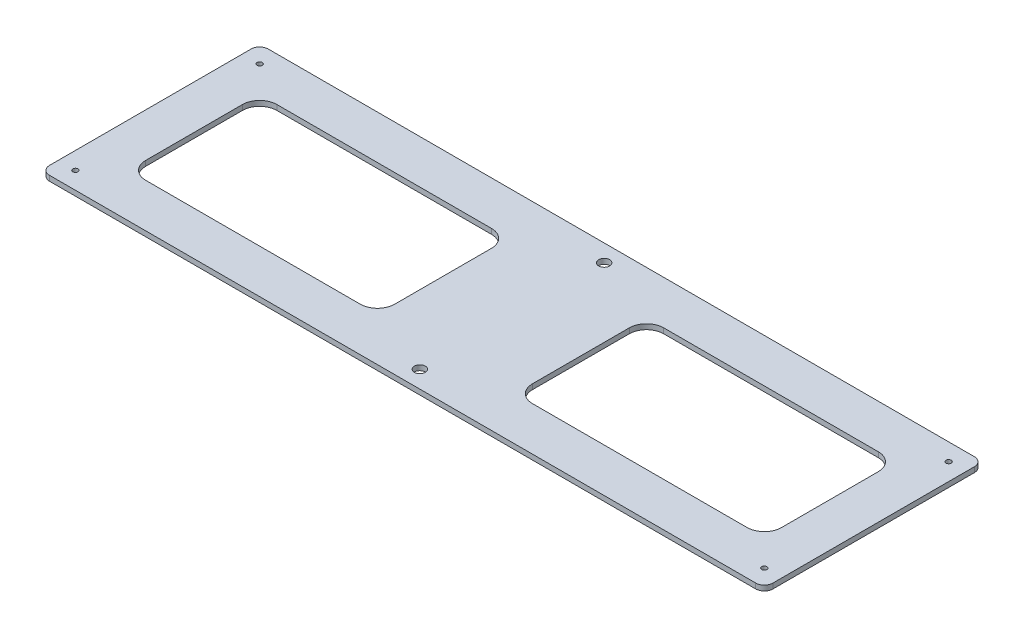
ISO-10303-21;
HEADER;
FILE_DESCRIPTION(('STEP AP214'),'2;1');
FILE_NAME('part.step','',(''),(''),'','','');
FILE_SCHEMA(('AUTOMOTIVE_DESIGN { 1 0 10303 214 1 1 1 1 }'));
ENDSEC;
DATA;
#1=APPLICATION_CONTEXT('core data for automotive mechanical design processes');
#2=APPLICATION_PROTOCOL_DEFINITION('international standard','automotive_design',2000,#1);
#3=PRODUCT_CONTEXT('',#1,'mechanical');
#4=PRODUCT('Part','Part','',(#3));
#5=PRODUCT_RELATED_PRODUCT_CATEGORY('part','',(#4));
#6=PRODUCT_DEFINITION_FORMATION('','',#4);
#7=PRODUCT_DEFINITION_CONTEXT('part definition',#1,'design');
#8=PRODUCT_DEFINITION('design','',#6,#7);
#9=PRODUCT_DEFINITION_SHAPE('','',#8);
#10=(LENGTH_UNIT() NAMED_UNIT(*) SI_UNIT(.MILLI.,.METRE.));
#11=(NAMED_UNIT(*) PLANE_ANGLE_UNIT() SI_UNIT($,.RADIAN.));
#12=(NAMED_UNIT(*) SI_UNIT($,.STERADIAN.) SOLID_ANGLE_UNIT());
#13=UNCERTAINTY_MEASURE_WITH_UNIT(LENGTH_MEASURE(1.E-05),#10,'distance_accuracy_value','');
#14=(GEOMETRIC_REPRESENTATION_CONTEXT(3) GLOBAL_UNCERTAINTY_ASSIGNED_CONTEXT((#13)) GLOBAL_UNIT_ASSIGNED_CONTEXT((#10,
#11,#12)) REPRESENTATION_CONTEXT('',''));
#15=CARTESIAN_POINT('',(0.,0.,0.));
#16=DIRECTION('',(0.,0.,1.));
#17=DIRECTION('',(1.,0.,0.));
#18=AXIS2_PLACEMENT_3D('',#15,#16,#17);
#19=CARTESIAN_POINT('',(210.,3.,-63.5));
#20=DIRECTION('',(-1.,0.,0.));
#21=DIRECTION('',(0.,0.,1.));
#22=AXIS2_PLACEMENT_3D('',#19,#20,#21);
#23=PLANE('',#22);
#24=DIRECTION('',(0.,0.,-1.));
#25=VECTOR('',#24,1.);
#26=CARTESIAN_POINT('',(210.,0.,-63.5));
#27=LINE('',#26,#25);
#28=CARTESIAN_POINT('',(210.,0.,58.5));
#29=VERTEX_POINT('',#28);
#30=CARTESIAN_POINT('',(210.,0.,-58.5));
#31=VERTEX_POINT('',#30);
#32=EDGE_CURVE('E228',#29,#31,#27,.T.);
#33=ORIENTED_EDGE('',*,*,#32,.T.);
#34=DIRECTION('',(0.,-1.,0.));
#35=VECTOR('',#34,1.);
#36=CARTESIAN_POINT('',(210.,3.,-58.5));
#37=LINE('',#36,#35);
#38=CARTESIAN_POINT('',(210.,3.,-58.5));
#39=VERTEX_POINT('',#38);
#40=EDGE_CURVE('E252',#31,#39,#37,.F.);
#41=ORIENTED_EDGE('',*,*,#40,.T.);
#42=DIRECTION('',(0.,0.,-1.));
#43=VECTOR('',#42,1.);
#44=CARTESIAN_POINT('',(210.,3.,-63.5));
#45=LINE('',#44,#43);
#46=CARTESIAN_POINT('',(210.,3.,58.5));
#47=VERTEX_POINT('',#46);
#48=EDGE_CURVE('E226',#47,#39,#45,.T.);
#49=ORIENTED_EDGE('',*,*,#48,.F.);
#50=DIRECTION('',(0.,-1.,0.));
#51=VECTOR('',#50,1.);
#52=CARTESIAN_POINT('',(210.,3.,58.5));
#53=LINE('',#52,#51);
#54=EDGE_CURVE('E249',#47,#29,#53,.T.);
#55=ORIENTED_EDGE('',*,*,#54,.T.);
#56=EDGE_LOOP('',(#33,#41,#49,#55));
#57=FACE_BOUND('',#56,.T.);
#58=ADVANCED_FACE('F33',(#57),#23,.F.);
#59=CARTESIAN_POINT('',(-210.,3.,-63.5));
#60=DIRECTION('',(0.,0.,1.));
#61=DIRECTION('',(1.,0.,0.));
#62=AXIS2_PLACEMENT_3D('',#59,#60,#61);
#63=PLANE('',#62);
#64=DIRECTION('',(-1.,0.,0.));
#65=VECTOR('',#64,1.);
#66=CARTESIAN_POINT('',(-210.,0.,-63.5));
#67=LINE('',#66,#65);
#68=CARTESIAN_POINT('',(205.,0.,-63.5));
#69=VERTEX_POINT('',#68);
#70=CARTESIAN_POINT('',(-205.,0.,-63.5));
#71=VERTEX_POINT('',#70);
#72=EDGE_CURVE('E223',#69,#71,#67,.T.);
#73=ORIENTED_EDGE('',*,*,#72,.T.);
#74=DIRECTION('',(0.,-1.,0.));
#75=VECTOR('',#74,1.);
#76=CARTESIAN_POINT('',(-205.,3.,-63.5));
#77=LINE('',#76,#75);
#78=CARTESIAN_POINT('',(-205.,3.,-63.5));
#79=VERTEX_POINT('',#78);
#80=EDGE_CURVE('E201',#71,#79,#77,.F.);
#81=ORIENTED_EDGE('',*,*,#80,.T.);
#82=DIRECTION('',(-1.,0.,0.));
#83=VECTOR('',#82,1.);
#84=CARTESIAN_POINT('',(-210.,3.,-63.5));
#85=LINE('',#84,#83);
#86=CARTESIAN_POINT('',(205.,3.,-63.5));
#87=VERTEX_POINT('',#86);
#88=EDGE_CURVE('E410',#87,#79,#85,.T.);
#89=ORIENTED_EDGE('',*,*,#88,.F.);
#90=DIRECTION('',(0.,-1.,0.));
#91=VECTOR('',#90,1.);
#92=CARTESIAN_POINT('',(205.,3.,-63.5));
#93=LINE('',#92,#91);
#94=EDGE_CURVE('E206',#87,#69,#93,.T.);
#95=ORIENTED_EDGE('',*,*,#94,.T.);
#96=EDGE_LOOP('',(#73,#81,#89,#95));
#97=FACE_BOUND('',#96,.T.);
#98=ADVANCED_FACE('F429',(#97),#63,.F.);
#99=CARTESIAN_POINT('',(-210.,3.,-63.5));
#100=DIRECTION('',(1.,0.,0.));
#101=DIRECTION('',(0.,0.,-1.));
#102=AXIS2_PLACEMENT_3D('',#99,#100,#101);
#103=PLANE('',#102);
#104=DIRECTION('',(0.,0.,1.));
#105=VECTOR('',#104,1.);
#106=CARTESIAN_POINT('',(-210.,3.,-63.5));
#107=LINE('',#106,#105);
#108=CARTESIAN_POINT('',(-210.,3.,-58.5));
#109=VERTEX_POINT('',#108);
#110=CARTESIAN_POINT('',(-210.,3.,58.5));
#111=VERTEX_POINT('',#110);
#112=EDGE_CURVE('E216',#109,#111,#107,.T.);
#113=ORIENTED_EDGE('',*,*,#112,.F.);
#114=DIRECTION('',(0.,-1.,0.));
#115=VECTOR('',#114,1.);
#116=CARTESIAN_POINT('',(-210.,3.,-58.5));
#117=LINE('',#116,#115);
#118=CARTESIAN_POINT('',(-210.,0.,-58.5));
#119=VERTEX_POINT('',#118);
#120=EDGE_CURVE('E200',#109,#119,#117,.T.);
#121=ORIENTED_EDGE('',*,*,#120,.T.);
#122=DIRECTION('',(0.,0.,1.));
#123=VECTOR('',#122,1.);
#124=CARTESIAN_POINT('',(-210.,0.,-63.5));
#125=LINE('',#124,#123);
#126=CARTESIAN_POINT('',(-210.,0.,58.5));
#127=VERTEX_POINT('',#126);
#128=EDGE_CURVE('E213',#119,#127,#125,.T.);
#129=ORIENTED_EDGE('',*,*,#128,.T.);
#130=DIRECTION('',(0.,-1.,0.));
#131=VECTOR('',#130,1.);
#132=CARTESIAN_POINT('',(-210.,3.,58.5));
#133=LINE('',#132,#131);
#134=EDGE_CURVE('E218',#127,#111,#133,.F.);
#135=ORIENTED_EDGE('',*,*,#134,.T.);
#136=EDGE_LOOP('',(#113,#121,#129,#135));
#137=FACE_BOUND('',#136,.T.);
#138=ADVANCED_FACE('F212',(#137),#103,.F.);
#139=CARTESIAN_POINT('',(-210.,3.,63.5));
#140=DIRECTION('',(0.,0.,-1.));
#141=DIRECTION('',(-1.,0.,0.));
#142=AXIS2_PLACEMENT_3D('',#139,#140,#141);
#143=PLANE('',#142);
#144=DIRECTION('',(1.,0.,0.));
#145=VECTOR('',#144,1.);
#146=CARTESIAN_POINT('',(-210.,0.,63.5));
#147=LINE('',#146,#145);
#148=CARTESIAN_POINT('',(-205.,0.,63.5));
#149=VERTEX_POINT('',#148);
#150=CARTESIAN_POINT('',(205.,0.,63.5));
#151=VERTEX_POINT('',#150);
#152=EDGE_CURVE('E222',#149,#151,#147,.T.);
#153=ORIENTED_EDGE('',*,*,#152,.T.);
#154=DIRECTION('',(0.,-1.,0.));
#155=VECTOR('',#154,1.);
#156=CARTESIAN_POINT('',(205.,3.,63.5));
#157=LINE('',#156,#155);
#158=CARTESIAN_POINT('',(205.,3.,63.5));
#159=VERTEX_POINT('',#158);
#160=EDGE_CURVE('E257',#151,#159,#157,.F.);
#161=ORIENTED_EDGE('',*,*,#160,.T.);
#162=DIRECTION('',(1.,0.,0.));
#163=VECTOR('',#162,1.);
#164=CARTESIAN_POINT('',(-210.,3.,63.5));
#165=LINE('',#164,#163);
#166=CARTESIAN_POINT('',(-205.,3.,63.5));
#167=VERTEX_POINT('',#166);
#168=EDGE_CURVE('E232',#167,#159,#165,.T.);
#169=ORIENTED_EDGE('',*,*,#168,.F.);
#170=DIRECTION('',(0.,-1.,0.));
#171=VECTOR('',#170,1.);
#172=CARTESIAN_POINT('',(-205.,3.,63.5));
#173=LINE('',#172,#171);
#174=EDGE_CURVE('E254',#167,#149,#173,.T.);
#175=ORIENTED_EDGE('',*,*,#174,.T.);
#176=EDGE_LOOP('',(#153,#161,#169,#175));
#177=FACE_BOUND('',#176,.T.);
#178=ADVANCED_FACE('F436',(#177),#143,.F.);
#179=CARTESIAN_POINT('',(0.,3.,0.));
#180=DIRECTION('',(0.,1.,0.));
#181=DIRECTION('',(0.,0.,1.));
#182=AXIS2_PLACEMENT_3D('',#179,#180,#181);
#183=PLANE('',#182);
#184=CARTESIAN_POINT('',(0.,3.,53.5));
#185=DIRECTION('',(0.,1.,0.));
#186=DIRECTION('',(0.,0.,1.));
#187=AXIS2_PLACEMENT_3D('',#184,#185,#186);
#188=CIRCLE('',#187,3.175);
#189=CARTESIAN_POINT('',(0.,3.,56.675));
#190=VERTEX_POINT('',#189);
#191=EDGE_CURVE('E340',#190,#190,#188,.T.);
#192=ORIENTED_EDGE('',*,*,#191,.F.);
#193=EDGE_LOOP('',(#192));
#194=FACE_BOUND('',#193,.T.);
#195=CARTESIAN_POINT('',(0.,3.,-53.5));
#196=DIRECTION('',(0.,1.,0.));
#197=DIRECTION('',(0.,0.,1.));
#198=AXIS2_PLACEMENT_3D('',#195,#196,#197);
#199=CIRCLE('',#198,3.175);
#200=CARTESIAN_POINT('',(0.,3.,-50.325));
#201=VERTEX_POINT('',#200);
#202=EDGE_CURVE('E329',#201,#201,#199,.T.);
#203=ORIENTED_EDGE('',*,*,#202,.F.);
#204=EDGE_LOOP('',(#203));
#205=FACE_BOUND('',#204,.T.);
#206=DIRECTION('',(0.,0.,-1.));
#207=VECTOR('',#206,1.);
#208=CARTESIAN_POINT('',(184.6,3.,38.1));
#209=LINE('',#208,#207);
#210=CARTESIAN_POINT('',(184.6,3.,28.1));
#211=VERTEX_POINT('',#210);
#212=CARTESIAN_POINT('',(184.6,3.,-28.1));
#213=VERTEX_POINT('',#212);
#214=EDGE_CURVE('E328',#211,#213,#209,.T.);
#215=ORIENTED_EDGE('',*,*,#214,.F.);
#216=CARTESIAN_POINT('',(174.6,3.,28.1));
#217=DIRECTION('',(0.,1.,0.));
#218=DIRECTION('',(0.,0.,1.));
#219=AXIS2_PLACEMENT_3D('',#216,#217,#218);
#220=CIRCLE('',#219,10.);
#221=CARTESIAN_POINT('',(174.6,3.,38.1));
#222=VERTEX_POINT('',#221);
#223=EDGE_CURVE('E322',#211,#222,#220,.F.);
#224=ORIENTED_EDGE('',*,*,#223,.T.);
#225=DIRECTION('',(1.,0.,0.));
#226=VECTOR('',#225,1.);
#227=CARTESIAN_POINT('',(184.6,3.,38.1));
#228=LINE('',#227,#226);
#229=CARTESIAN_POINT('',(50.,3.,38.1));
#230=VERTEX_POINT('',#229);
#231=EDGE_CURVE('E347',#230,#222,#228,.T.);
#232=ORIENTED_EDGE('',*,*,#231,.F.);
#233=CARTESIAN_POINT('',(50.,3.,28.1));
#234=DIRECTION('',(0.,1.,0.));
#235=DIRECTION('',(0.,0.,1.));
#236=AXIS2_PLACEMENT_3D('',#233,#234,#235);
#237=CIRCLE('',#236,10.);
#238=CARTESIAN_POINT('',(40.,3.,28.1));
#239=VERTEX_POINT('',#238);
#240=EDGE_CURVE('E42',#230,#239,#237,.F.);
#241=ORIENTED_EDGE('',*,*,#240,.T.);
#242=DIRECTION('',(0.,0.,1.));
#243=VECTOR('',#242,1.);
#244=CARTESIAN_POINT('',(40.,3.,38.1));
#245=LINE('',#244,#243);
#246=CARTESIAN_POINT('',(40.,3.,-28.1));
#247=VERTEX_POINT('',#246);
#248=EDGE_CURVE('E357',#247,#239,#245,.T.);
#249=ORIENTED_EDGE('',*,*,#248,.F.);
#250=CARTESIAN_POINT('',(50.,3.,-28.1));
#251=DIRECTION('',(0.,1.,0.));
#252=DIRECTION('',(0.,0.,1.));
#253=AXIS2_PLACEMENT_3D('',#250,#251,#252);
#254=CIRCLE('',#253,10.);
#255=CARTESIAN_POINT('',(50.,3.,-38.1));
#256=VERTEX_POINT('',#255);
#257=EDGE_CURVE('E314',#247,#256,#254,.F.);
#258=ORIENTED_EDGE('',*,*,#257,.T.);
#259=DIRECTION('',(-1.,0.,0.));
#260=VECTOR('',#259,1.);
#261=CARTESIAN_POINT('',(184.6,3.,-38.1));
#262=LINE('',#261,#260);
#263=CARTESIAN_POINT('',(174.6,3.,-38.1));
#264=VERTEX_POINT('',#263);
#265=EDGE_CURVE('E333',#264,#256,#262,.T.);
#266=ORIENTED_EDGE('',*,*,#265,.F.);
#267=CARTESIAN_POINT('',(174.6,3.,-28.1));
#268=DIRECTION('',(0.,1.,0.));
#269=DIRECTION('',(0.,0.,1.));
#270=AXIS2_PLACEMENT_3D('',#267,#268,#269);
#271=CIRCLE('',#270,10.);
#272=EDGE_CURVE('E318',#264,#213,#271,.F.);
#273=ORIENTED_EDGE('',*,*,#272,.T.);
#274=EDGE_LOOP('',(#215,#224,#232,#241,#249,#258,#266,#273));
#275=FACE_BOUND('',#274,.T.);
#276=DIRECTION('',(-1.,0.,0.));
#277=VECTOR('',#276,1.);
#278=CARTESIAN_POINT('',(-40.,3.,-38.1));
#279=LINE('',#278,#277);
#280=CARTESIAN_POINT('',(-50.,3.,-38.1));
#281=VERTEX_POINT('',#280);
#282=CARTESIAN_POINT('',(-174.6,3.,-38.1));
#283=VERTEX_POINT('',#282);
#284=EDGE_CURVE('E353',#281,#283,#279,.T.);
#285=ORIENTED_EDGE('',*,*,#284,.F.);
#286=CARTESIAN_POINT('',(-50.,3.,-28.1));
#287=DIRECTION('',(0.,1.,0.));
#288=DIRECTION('',(0.,0.,1.));
#289=AXIS2_PLACEMENT_3D('',#286,#287,#288);
#290=CIRCLE('',#289,10.);
#291=CARTESIAN_POINT('',(-40.,3.,-28.1));
#292=VERTEX_POINT('',#291);
#293=EDGE_CURVE('E306',#281,#292,#290,.F.);
#294=ORIENTED_EDGE('',*,*,#293,.T.);
#295=DIRECTION('',(0.,0.,-1.));
#296=VECTOR('',#295,1.);
#297=CARTESIAN_POINT('',(-40.,3.,38.1));
#298=LINE('',#297,#296);
#299=CARTESIAN_POINT('',(-40.,3.,28.1));
#300=VERTEX_POINT('',#299);
#301=EDGE_CURVE('E365',#300,#292,#298,.T.);
#302=ORIENTED_EDGE('',*,*,#301,.F.);
#303=CARTESIAN_POINT('',(-50.,3.,28.1));
#304=DIRECTION('',(0.,1.,0.));
#305=DIRECTION('',(0.,0.,1.));
#306=AXIS2_PLACEMENT_3D('',#303,#304,#305);
#307=CIRCLE('',#306,10.);
#308=CARTESIAN_POINT('',(-50.,3.,38.1));
#309=VERTEX_POINT('',#308);
#310=EDGE_CURVE('E310',#300,#309,#307,.F.);
#311=ORIENTED_EDGE('',*,*,#310,.T.);
#312=DIRECTION('',(1.,0.,0.));
#313=VECTOR('',#312,1.);
#314=CARTESIAN_POINT('',(-40.,3.,38.1));
#315=LINE('',#314,#313);
#316=CARTESIAN_POINT('',(-174.6,3.,38.1));
#317=VERTEX_POINT('',#316);
#318=EDGE_CURVE('E380',#317,#309,#315,.T.);
#319=ORIENTED_EDGE('',*,*,#318,.F.);
#320=CARTESIAN_POINT('',(-174.6,3.,28.1));
#321=DIRECTION('',(0.,1.,0.));
#322=DIRECTION('',(0.,0.,1.));
#323=AXIS2_PLACEMENT_3D('',#320,#321,#322);
#324=CIRCLE('',#323,10.);
#325=CARTESIAN_POINT('',(-184.6,3.,28.1));
#326=VERTEX_POINT('',#325);
#327=EDGE_CURVE('E298',#317,#326,#324,.F.);
#328=ORIENTED_EDGE('',*,*,#327,.T.);
#329=DIRECTION('',(0.,0.,1.));
#330=VECTOR('',#329,1.);
#331=CARTESIAN_POINT('',(-184.6,3.,38.1));
#332=LINE('',#331,#330);
#333=CARTESIAN_POINT('',(-184.6,3.,-28.1));
#334=VERTEX_POINT('',#333);
#335=EDGE_CURVE('E377',#334,#326,#332,.T.);
#336=ORIENTED_EDGE('',*,*,#335,.F.);
#337=CARTESIAN_POINT('',(-174.6,3.,-28.1));
#338=DIRECTION('',(0.,1.,0.));
#339=DIRECTION('',(0.,0.,1.));
#340=AXIS2_PLACEMENT_3D('',#337,#338,#339);
#341=CIRCLE('',#340,10.);
#342=EDGE_CURVE('E302',#334,#283,#341,.F.);
#343=ORIENTED_EDGE('',*,*,#342,.T.);
#344=EDGE_LOOP('',(#285,#294,#302,#311,#319,#328,#336,#343));
#345=FACE_BOUND('',#344,.T.);
#346=CARTESIAN_POINT('',(-200.,3.,53.5));
#347=DIRECTION('',(0.,1.,0.));
#348=DIRECTION('',(0.,0.,1.));
#349=AXIS2_PLACEMENT_3D('',#346,#347,#348);
#350=CIRCLE('',#349,1.5);
#351=CARTESIAN_POINT('',(-200.,3.,55.));
#352=VERTEX_POINT('',#351);
#353=EDGE_CURVE('E389',#352,#352,#350,.T.);
#354=ORIENTED_EDGE('',*,*,#353,.F.);
#355=EDGE_LOOP('',(#354));
#356=FACE_BOUND('',#355,.T.);
#357=CARTESIAN_POINT('',(-200.,3.,-53.5));
#358=DIRECTION('',(0.,1.,0.));
#359=DIRECTION('',(0.,0.,1.));
#360=AXIS2_PLACEMENT_3D('',#357,#358,#359);
#361=CIRCLE('',#360,1.5);
#362=CARTESIAN_POINT('',(-200.,3.,-52.));
#363=VERTEX_POINT('',#362);
#364=EDGE_CURVE('E395',#363,#363,#361,.T.);
#365=ORIENTED_EDGE('',*,*,#364,.F.);
#366=EDGE_LOOP('',(#365));
#367=FACE_BOUND('',#366,.T.);
#368=CARTESIAN_POINT('',(200.,3.,-53.5));
#369=DIRECTION('',(0.,1.,0.));
#370=DIRECTION('',(0.,0.,1.));
#371=AXIS2_PLACEMENT_3D('',#368,#369,#370);
#372=CIRCLE('',#371,1.5);
#373=CARTESIAN_POINT('',(200.,3.,-52.));
#374=VERTEX_POINT('',#373);
#375=EDGE_CURVE('E374',#374,#374,#372,.T.);
#376=ORIENTED_EDGE('',*,*,#375,.F.);
#377=EDGE_LOOP('',(#376));
#378=FACE_BOUND('',#377,.T.);
#379=CARTESIAN_POINT('',(200.,3.,53.5));
#380=DIRECTION('',(0.,1.,0.));
#381=DIRECTION('',(0.,0.,1.));
#382=AXIS2_PLACEMENT_3D('',#379,#380,#381);
#383=CIRCLE('',#382,1.5);
#384=CARTESIAN_POINT('',(200.,3.,55.));
#385=VERTEX_POINT('',#384);
#386=EDGE_CURVE('E388',#385,#385,#383,.T.);
#387=ORIENTED_EDGE('',*,*,#386,.F.);
#388=EDGE_LOOP('',(#387));
#389=FACE_BOUND('',#388,.T.);
#390=ORIENTED_EDGE('',*,*,#88,.T.);
#391=CARTESIAN_POINT('',(-205.,3.,-58.5));
#392=DIRECTION('',(0.,1.,0.));
#393=DIRECTION('',(0.,0.,1.));
#394=AXIS2_PLACEMENT_3D('',#391,#392,#393);
#395=CIRCLE('',#394,5.);
#396=EDGE_CURVE('E247',#79,#109,#395,.T.);
#397=ORIENTED_EDGE('',*,*,#396,.T.);
#398=ORIENTED_EDGE('',*,*,#112,.T.);
#399=CARTESIAN_POINT('',(-205.,3.,58.5));
#400=DIRECTION('',(0.,1.,0.));
#401=DIRECTION('',(0.,0.,1.));
#402=AXIS2_PLACEMENT_3D('',#399,#400,#401);
#403=CIRCLE('',#402,5.);
#404=EDGE_CURVE('E241',#111,#167,#403,.T.);
#405=ORIENTED_EDGE('',*,*,#404,.T.);
#406=ORIENTED_EDGE('',*,*,#168,.T.);
#407=CARTESIAN_POINT('',(205.,3.,58.5));
#408=DIRECTION('',(0.,1.,0.));
#409=DIRECTION('',(0.,0.,1.));
#410=AXIS2_PLACEMENT_3D('',#407,#408,#409);
#411=CIRCLE('',#410,5.);
#412=EDGE_CURVE('E243',#159,#47,#411,.T.);
#413=ORIENTED_EDGE('',*,*,#412,.T.);
#414=ORIENTED_EDGE('',*,*,#48,.T.);
#415=CARTESIAN_POINT('',(205.,3.,-58.5));
#416=DIRECTION('',(0.,1.,0.));
#417=DIRECTION('',(0.,0.,1.));
#418=AXIS2_PLACEMENT_3D('',#415,#416,#417);
#419=CIRCLE('',#418,5.);
#420=EDGE_CURVE('E245',#39,#87,#419,.T.);
#421=ORIENTED_EDGE('',*,*,#420,.T.);
#422=EDGE_LOOP('',(#390,#397,#398,#405,#406,#413,#414,#421));
#423=FACE_BOUND('',#422,.T.);
#424=ADVANCED_FACE('F427',(#194,#205,#275,#345,#356,#367,#378,#389,#423),#183,.T.);
#425=CARTESIAN_POINT('',(0.,0.,0.));
#426=DIRECTION('',(0.,1.,0.));
#427=DIRECTION('',(0.,0.,1.));
#428=AXIS2_PLACEMENT_3D('',#425,#426,#427);
#429=PLANE('',#428);
#430=CARTESIAN_POINT('',(0.,0.,53.5));
#431=DIRECTION('',(0.,1.,0.));
#432=DIRECTION('',(0.,0.,1.));
#433=AXIS2_PLACEMENT_3D('',#430,#431,#432);
#434=CIRCLE('',#433,3.175);
#435=CARTESIAN_POINT('',(0.,0.,56.675));
#436=VERTEX_POINT('',#435);
#437=EDGE_CURVE('E37',#436,#436,#434,.T.);
#438=ORIENTED_EDGE('',*,*,#437,.T.);
#439=EDGE_LOOP('',(#438));
#440=FACE_BOUND('',#439,.T.);
#441=CARTESIAN_POINT('',(0.,0.,-53.5));
#442=DIRECTION('',(0.,1.,0.));
#443=DIRECTION('',(0.,0.,1.));
#444=AXIS2_PLACEMENT_3D('',#441,#442,#443);
#445=CIRCLE('',#444,3.175);
#446=CARTESIAN_POINT('',(0.,0.,-50.325));
#447=VERTEX_POINT('',#446);
#448=EDGE_CURVE('E326',#447,#447,#445,.T.);
#449=ORIENTED_EDGE('',*,*,#448,.T.);
#450=EDGE_LOOP('',(#449));
#451=FACE_BOUND('',#450,.T.);
#452=DIRECTION('',(0.,0.,1.));
#453=VECTOR('',#452,1.);
#454=CARTESIAN_POINT('',(40.,0.,38.1));
#455=LINE('',#454,#453);
#456=CARTESIAN_POINT('',(40.,0.,-28.1));
#457=VERTEX_POINT('',#456);
#458=CARTESIAN_POINT('',(40.,0.,28.1));
#459=VERTEX_POINT('',#458);
#460=EDGE_CURVE('E350',#457,#459,#455,.T.);
#461=ORIENTED_EDGE('',*,*,#460,.T.);
#462=CARTESIAN_POINT('',(50.,0.,28.1));
#463=DIRECTION('',(0.,1.,0.));
#464=DIRECTION('',(0.,0.,1.));
#465=AXIS2_PLACEMENT_3D('',#462,#463,#464);
#466=CIRCLE('',#465,10.);
#467=CARTESIAN_POINT('',(50.,0.,38.1));
#468=VERTEX_POINT('',#467);
#469=EDGE_CURVE('E11',#459,#468,#466,.T.);
#470=ORIENTED_EDGE('',*,*,#469,.T.);
#471=DIRECTION('',(1.,0.,0.));
#472=VECTOR('',#471,1.);
#473=CARTESIAN_POINT('',(184.6,0.,38.1));
#474=LINE('',#473,#472);
#475=CARTESIAN_POINT('',(174.6,0.,38.1));
#476=VERTEX_POINT('',#475);
#477=EDGE_CURVE('E352',#468,#476,#474,.T.);
#478=ORIENTED_EDGE('',*,*,#477,.T.);
#479=CARTESIAN_POINT('',(174.6,0.,28.1));
#480=DIRECTION('',(0.,1.,0.));
#481=DIRECTION('',(0.,0.,1.));
#482=AXIS2_PLACEMENT_3D('',#479,#480,#481);
#483=CIRCLE('',#482,10.);
#484=CARTESIAN_POINT('',(184.6,0.,28.1));
#485=VERTEX_POINT('',#484);
#486=EDGE_CURVE('E324',#476,#485,#483,.T.);
#487=ORIENTED_EDGE('',*,*,#486,.T.);
#488=DIRECTION('',(0.,0.,-1.));
#489=VECTOR('',#488,1.);
#490=CARTESIAN_POINT('',(184.6,0.,38.1));
#491=LINE('',#490,#489);
#492=CARTESIAN_POINT('',(184.6,0.,-28.1));
#493=VERTEX_POINT('',#492);
#494=EDGE_CURVE('E343',#485,#493,#491,.T.);
#495=ORIENTED_EDGE('',*,*,#494,.T.);
#496=CARTESIAN_POINT('',(174.6,0.,-28.1));
#497=DIRECTION('',(0.,1.,0.));
#498=DIRECTION('',(0.,0.,1.));
#499=AXIS2_PLACEMENT_3D('',#496,#497,#498);
#500=CIRCLE('',#499,10.);
#501=CARTESIAN_POINT('',(174.6,0.,-38.1));
#502=VERTEX_POINT('',#501);
#503=EDGE_CURVE('E320',#493,#502,#500,.T.);
#504=ORIENTED_EDGE('',*,*,#503,.T.);
#505=DIRECTION('',(-1.,0.,0.));
#506=VECTOR('',#505,1.);
#507=CARTESIAN_POINT('',(184.6,0.,-38.1));
#508=LINE('',#507,#506);
#509=CARTESIAN_POINT('',(50.,0.,-38.1));
#510=VERTEX_POINT('',#509);
#511=EDGE_CURVE('E346',#502,#510,#508,.T.);
#512=ORIENTED_EDGE('',*,*,#511,.T.);
#513=CARTESIAN_POINT('',(50.,0.,-28.1));
#514=DIRECTION('',(0.,1.,0.));
#515=DIRECTION('',(0.,0.,1.));
#516=AXIS2_PLACEMENT_3D('',#513,#514,#515);
#517=CIRCLE('',#516,10.);
#518=EDGE_CURVE('E316',#510,#457,#517,.T.);
#519=ORIENTED_EDGE('',*,*,#518,.T.);
#520=EDGE_LOOP('',(#461,#470,#478,#487,#495,#504,#512,#519));
#521=FACE_BOUND('',#520,.T.);
#522=DIRECTION('',(1.,0.,0.));
#523=VECTOR('',#522,1.);
#524=CARTESIAN_POINT('',(-40.,0.,38.1));
#525=LINE('',#524,#523);
#526=CARTESIAN_POINT('',(-174.6,0.,38.1));
#527=VERTEX_POINT('',#526);
#528=CARTESIAN_POINT('',(-50.,0.,38.1));
#529=VERTEX_POINT('',#528);
#530=EDGE_CURVE('E368',#527,#529,#525,.T.);
#531=ORIENTED_EDGE('',*,*,#530,.T.);
#532=CARTESIAN_POINT('',(-50.,0.,28.1));
#533=DIRECTION('',(0.,1.,0.));
#534=DIRECTION('',(0.,0.,1.));
#535=AXIS2_PLACEMENT_3D('',#532,#533,#534);
#536=CIRCLE('',#535,10.);
#537=CARTESIAN_POINT('',(-40.,0.,28.1));
#538=VERTEX_POINT('',#537);
#539=EDGE_CURVE('E312',#529,#538,#536,.T.);
#540=ORIENTED_EDGE('',*,*,#539,.T.);
#541=DIRECTION('',(0.,0.,-1.));
#542=VECTOR('',#541,1.);
#543=CARTESIAN_POINT('',(-40.,0.,38.1));
#544=LINE('',#543,#542);
#545=CARTESIAN_POINT('',(-40.,0.,-28.1));
#546=VERTEX_POINT('',#545);
#547=EDGE_CURVE('E371',#538,#546,#544,.T.);
#548=ORIENTED_EDGE('',*,*,#547,.T.);
#549=CARTESIAN_POINT('',(-50.,0.,-28.1));
#550=DIRECTION('',(0.,1.,0.));
#551=DIRECTION('',(0.,0.,1.));
#552=AXIS2_PLACEMENT_3D('',#549,#550,#551);
#553=CIRCLE('',#552,10.);
#554=CARTESIAN_POINT('',(-50.,0.,-38.1));
#555=VERTEX_POINT('',#554);
#556=EDGE_CURVE('E308',#546,#555,#553,.T.);
#557=ORIENTED_EDGE('',*,*,#556,.T.);
#558=DIRECTION('',(-1.,0.,0.));
#559=VECTOR('',#558,1.);
#560=CARTESIAN_POINT('',(-40.,0.,-38.1));
#561=LINE('',#560,#559);
#562=CARTESIAN_POINT('',(-174.6,0.,-38.1));
#563=VERTEX_POINT('',#562);
#564=EDGE_CURVE('E361',#555,#563,#561,.T.);
#565=ORIENTED_EDGE('',*,*,#564,.T.);
#566=CARTESIAN_POINT('',(-174.6,0.,-28.1));
#567=DIRECTION('',(0.,1.,0.));
#568=DIRECTION('',(0.,0.,1.));
#569=AXIS2_PLACEMENT_3D('',#566,#567,#568);
#570=CIRCLE('',#569,10.);
#571=CARTESIAN_POINT('',(-184.6,0.,-28.1));
#572=VERTEX_POINT('',#571);
#573=EDGE_CURVE('E304',#563,#572,#570,.T.);
#574=ORIENTED_EDGE('',*,*,#573,.T.);
#575=DIRECTION('',(0.,0.,1.));
#576=VECTOR('',#575,1.);
#577=CARTESIAN_POINT('',(-184.6,0.,38.1));
#578=LINE('',#577,#576);
#579=CARTESIAN_POINT('',(-184.6,0.,28.1));
#580=VERTEX_POINT('',#579);
#581=EDGE_CURVE('E364',#572,#580,#578,.T.);
#582=ORIENTED_EDGE('',*,*,#581,.T.);
#583=CARTESIAN_POINT('',(-174.6,0.,28.1));
#584=DIRECTION('',(0.,1.,0.));
#585=DIRECTION('',(0.,0.,1.));
#586=AXIS2_PLACEMENT_3D('',#583,#584,#585);
#587=CIRCLE('',#586,10.);
#588=EDGE_CURVE('E300',#580,#527,#587,.T.);
#589=ORIENTED_EDGE('',*,*,#588,.T.);
#590=EDGE_LOOP('',(#531,#540,#548,#557,#565,#574,#582,#589));
#591=FACE_BOUND('',#590,.T.);
#592=CARTESIAN_POINT('',(-200.,0.,53.5));
#593=DIRECTION('',(0.,1.,0.));
#594=DIRECTION('',(0.,0.,1.));
#595=AXIS2_PLACEMENT_3D('',#592,#593,#594);
#596=CIRCLE('',#595,1.5);
#597=CARTESIAN_POINT('',(-200.,0.,55.));
#598=VERTEX_POINT('',#597);
#599=EDGE_CURVE('E385',#598,#598,#596,.T.);
#600=ORIENTED_EDGE('',*,*,#599,.T.);
#601=EDGE_LOOP('',(#600));
#602=FACE_BOUND('',#601,.T.);
#603=CARTESIAN_POINT('',(-200.,0.,-53.5));
#604=DIRECTION('',(0.,1.,0.));
#605=DIRECTION('',(0.,0.,1.));
#606=AXIS2_PLACEMENT_3D('',#603,#604,#605);
#607=CIRCLE('',#606,1.5);
#608=CARTESIAN_POINT('',(-200.,0.,-52.));
#609=VERTEX_POINT('',#608);
#610=EDGE_CURVE('E392',#609,#609,#607,.T.);
#611=ORIENTED_EDGE('',*,*,#610,.T.);
#612=EDGE_LOOP('',(#611));
#613=FACE_BOUND('',#612,.T.);
#614=CARTESIAN_POINT('',(200.,0.,-53.5));
#615=DIRECTION('',(0.,1.,0.));
#616=DIRECTION('',(0.,0.,1.));
#617=AXIS2_PLACEMENT_3D('',#614,#615,#616);
#618=CIRCLE('',#617,1.5);
#619=CARTESIAN_POINT('',(200.,0.,-52.));
#620=VERTEX_POINT('',#619);
#621=EDGE_CURVE('E398',#620,#620,#618,.T.);
#622=ORIENTED_EDGE('',*,*,#621,.T.);
#623=EDGE_LOOP('',(#622));
#624=FACE_BOUND('',#623,.T.);
#625=CARTESIAN_POINT('',(200.,0.,53.5));
#626=DIRECTION('',(0.,1.,0.));
#627=DIRECTION('',(0.,0.,1.));
#628=AXIS2_PLACEMENT_3D('',#625,#626,#627);
#629=CIRCLE('',#628,1.5);
#630=CARTESIAN_POINT('',(200.,0.,55.));
#631=VERTEX_POINT('',#630);
#632=EDGE_CURVE('E403',#631,#631,#629,.T.);
#633=ORIENTED_EDGE('',*,*,#632,.T.);
#634=EDGE_LOOP('',(#633));
#635=FACE_BOUND('',#634,.T.);
#636=ORIENTED_EDGE('',*,*,#128,.F.);
#637=CARTESIAN_POINT('',(-205.,0.,-58.5));
#638=DIRECTION('',(0.,1.,0.));
#639=DIRECTION('',(0.,0.,1.));
#640=AXIS2_PLACEMENT_3D('',#637,#638,#639);
#641=CIRCLE('',#640,5.);
#642=EDGE_CURVE('E196',#119,#71,#641,.F.);
#643=ORIENTED_EDGE('',*,*,#642,.T.);
#644=ORIENTED_EDGE('',*,*,#72,.F.);
#645=CARTESIAN_POINT('',(205.,0.,-58.5));
#646=DIRECTION('',(0.,1.,0.));
#647=DIRECTION('',(0.,0.,1.));
#648=AXIS2_PLACEMENT_3D('',#645,#646,#647);
#649=CIRCLE('',#648,5.);
#650=EDGE_CURVE('E207',#69,#31,#649,.F.);
#651=ORIENTED_EDGE('',*,*,#650,.T.);
#652=ORIENTED_EDGE('',*,*,#32,.F.);
#653=CARTESIAN_POINT('',(205.,0.,58.5));
#654=DIRECTION('',(0.,1.,0.));
#655=DIRECTION('',(0.,0.,1.));
#656=AXIS2_PLACEMENT_3D('',#653,#654,#655);
#657=CIRCLE('',#656,5.);
#658=EDGE_CURVE('E235',#29,#151,#657,.F.);
#659=ORIENTED_EDGE('',*,*,#658,.T.);
#660=ORIENTED_EDGE('',*,*,#152,.F.);
#661=CARTESIAN_POINT('',(-205.,0.,58.5));
#662=DIRECTION('',(0.,1.,0.));
#663=DIRECTION('',(0.,0.,1.));
#664=AXIS2_PLACEMENT_3D('',#661,#662,#663);
#665=CIRCLE('',#664,5.);
#666=EDGE_CURVE('E217',#149,#127,#665,.F.);
#667=ORIENTED_EDGE('',*,*,#666,.T.);
#668=EDGE_LOOP('',(#636,#643,#644,#651,#652,#659,#660,#667));
#669=FACE_BOUND('',#668,.T.);
#670=ADVANCED_FACE('F220',(#440,#451,#521,#591,#602,#613,#624,#635,#669),#429,.F.);
#671=CARTESIAN_POINT('',(-205.,3.,-58.5));
#672=DIRECTION('',(0.,-1.,0.));
#673=DIRECTION('',(0.,0.,-1.));
#674=AXIS2_PLACEMENT_3D('',#671,#672,#673);
#675=CYLINDRICAL_SURFACE('',#674,5.);
#676=ORIENTED_EDGE('',*,*,#396,.F.);
#677=ORIENTED_EDGE('',*,*,#80,.F.);
#678=ORIENTED_EDGE('',*,*,#642,.F.);
#679=ORIENTED_EDGE('',*,*,#120,.F.);
#680=EDGE_LOOP('',(#676,#677,#678,#679));
#681=FACE_BOUND('',#680,.T.);
#682=ADVANCED_FACE('F199',(#681),#675,.T.);
#683=CARTESIAN_POINT('',(205.,3.,-58.5));
#684=DIRECTION('',(0.,-1.,0.));
#685=DIRECTION('',(0.,0.,-1.));
#686=AXIS2_PLACEMENT_3D('',#683,#684,#685);
#687=CYLINDRICAL_SURFACE('',#686,5.);
#688=ORIENTED_EDGE('',*,*,#420,.F.);
#689=ORIENTED_EDGE('',*,*,#40,.F.);
#690=ORIENTED_EDGE('',*,*,#650,.F.);
#691=ORIENTED_EDGE('',*,*,#94,.F.);
#692=EDGE_LOOP('',(#688,#689,#690,#691));
#693=FACE_BOUND('',#692,.T.);
#694=ADVANCED_FACE('F423',(#693),#687,.T.);
#695=CARTESIAN_POINT('',(205.,3.,58.5));
#696=DIRECTION('',(0.,-1.,0.));
#697=DIRECTION('',(0.,0.,-1.));
#698=AXIS2_PLACEMENT_3D('',#695,#696,#697);
#699=CYLINDRICAL_SURFACE('',#698,5.);
#700=ORIENTED_EDGE('',*,*,#412,.F.);
#701=ORIENTED_EDGE('',*,*,#160,.F.);
#702=ORIENTED_EDGE('',*,*,#658,.F.);
#703=ORIENTED_EDGE('',*,*,#54,.F.);
#704=EDGE_LOOP('',(#700,#701,#702,#703));
#705=FACE_BOUND('',#704,.T.);
#706=ADVANCED_FACE('F445',(#705),#699,.T.);
#707=CARTESIAN_POINT('',(-205.,3.,58.5));
#708=DIRECTION('',(0.,-1.,0.));
#709=DIRECTION('',(0.,0.,-1.));
#710=AXIS2_PLACEMENT_3D('',#707,#708,#709);
#711=CYLINDRICAL_SURFACE('',#710,5.);
#712=ORIENTED_EDGE('',*,*,#404,.F.);
#713=ORIENTED_EDGE('',*,*,#134,.F.);
#714=ORIENTED_EDGE('',*,*,#666,.F.);
#715=ORIENTED_EDGE('',*,*,#174,.F.);
#716=EDGE_LOOP('',(#712,#713,#714,#715));
#717=FACE_BOUND('',#716,.T.);
#718=ADVANCED_FACE('F448',(#717),#711,.T.);
#719=CARTESIAN_POINT('',(200.,0.,53.5));
#720=DIRECTION('',(0.,1.,0.));
#721=DIRECTION('',(0.,0.,1.));
#722=AXIS2_PLACEMENT_3D('',#719,#720,#721);
#723=CYLINDRICAL_SURFACE('',#722,1.5);
#724=ORIENTED_EDGE('',*,*,#632,.F.);
#725=EDGE_LOOP('',(#724));
#726=FACE_BOUND('',#725,.T.);
#727=ORIENTED_EDGE('',*,*,#386,.T.);
#728=EDGE_LOOP('',(#727));
#729=FACE_BOUND('',#728,.T.);
#730=ADVANCED_FACE('F452',(#726,#729),#723,.F.);
#731=CARTESIAN_POINT('',(200.,0.,-53.5));
#732=DIRECTION('',(0.,1.,0.));
#733=DIRECTION('',(0.,0.,1.));
#734=AXIS2_PLACEMENT_3D('',#731,#732,#733);
#735=CYLINDRICAL_SURFACE('',#734,1.5);
#736=ORIENTED_EDGE('',*,*,#621,.F.);
#737=EDGE_LOOP('',(#736));
#738=FACE_BOUND('',#737,.T.);
#739=ORIENTED_EDGE('',*,*,#375,.T.);
#740=EDGE_LOOP('',(#739));
#741=FACE_BOUND('',#740,.T.);
#742=ADVANCED_FACE('F526',(#738,#741),#735,.F.);
#743=CARTESIAN_POINT('',(-200.,0.,-53.5));
#744=DIRECTION('',(0.,1.,0.));
#745=DIRECTION('',(0.,0.,1.));
#746=AXIS2_PLACEMENT_3D('',#743,#744,#745);
#747=CYLINDRICAL_SURFACE('',#746,1.5);
#748=ORIENTED_EDGE('',*,*,#610,.F.);
#749=EDGE_LOOP('',(#748));
#750=FACE_BOUND('',#749,.T.);
#751=ORIENTED_EDGE('',*,*,#364,.T.);
#752=EDGE_LOOP('',(#751));
#753=FACE_BOUND('',#752,.T.);
#754=ADVANCED_FACE('F532',(#750,#753),#747,.F.);
#755=CARTESIAN_POINT('',(-200.,0.,53.5));
#756=DIRECTION('',(0.,1.,0.));
#757=DIRECTION('',(0.,0.,1.));
#758=AXIS2_PLACEMENT_3D('',#755,#756,#757);
#759=CYLINDRICAL_SURFACE('',#758,1.5);
#760=ORIENTED_EDGE('',*,*,#599,.F.);
#761=EDGE_LOOP('',(#760));
#762=FACE_BOUND('',#761,.T.);
#763=ORIENTED_EDGE('',*,*,#353,.T.);
#764=EDGE_LOOP('',(#763));
#765=FACE_BOUND('',#764,.T.);
#766=ADVANCED_FACE('F600',(#762,#765),#759,.F.);
#767=CARTESIAN_POINT('',(-40.,0.,-38.1));
#768=DIRECTION('',(0.,0.,-1.));
#769=DIRECTION('',(-1.,0.,0.));
#770=AXIS2_PLACEMENT_3D('',#767,#768,#769);
#771=PLANE('',#770);
#772=ORIENTED_EDGE('',*,*,#284,.T.);
#773=DIRECTION('',(0.,1.,0.));
#774=VECTOR('',#773,1.);
#775=CARTESIAN_POINT('',(-174.6,0.,-38.1));
#776=LINE('',#775,#774);
#777=EDGE_CURVE('E272',#283,#563,#776,.F.);
#778=ORIENTED_EDGE('',*,*,#777,.T.);
#779=ORIENTED_EDGE('',*,*,#564,.F.);
#780=DIRECTION('',(0.,1.,0.));
#781=VECTOR('',#780,1.);
#782=CARTESIAN_POINT('',(-50.,3.,-38.1));
#783=LINE('',#782,#781);
#784=EDGE_CURVE('E269',#555,#281,#783,.T.);
#785=ORIENTED_EDGE('',*,*,#784,.T.);
#786=EDGE_LOOP('',(#772,#778,#779,#785));
#787=FACE_BOUND('',#786,.T.);
#788=ADVANCED_FACE('F609',(#787),#771,.F.);
#789=CARTESIAN_POINT('',(-40.,0.,38.1));
#790=DIRECTION('',(1.,0.,0.));
#791=DIRECTION('',(0.,0.,-1.));
#792=AXIS2_PLACEMENT_3D('',#789,#790,#791);
#793=PLANE('',#792);
#794=ORIENTED_EDGE('',*,*,#301,.T.);
#795=DIRECTION('',(0.,1.,0.));
#796=VECTOR('',#795,1.);
#797=CARTESIAN_POINT('',(-40.,0.,-28.1));
#798=LINE('',#797,#796);
#799=EDGE_CURVE('E277',#292,#546,#798,.F.);
#800=ORIENTED_EDGE('',*,*,#799,.T.);
#801=ORIENTED_EDGE('',*,*,#547,.F.);
#802=DIRECTION('',(0.,1.,0.));
#803=VECTOR('',#802,1.);
#804=CARTESIAN_POINT('',(-40.,3.,28.1));
#805=LINE('',#804,#803);
#806=EDGE_CURVE('E274',#538,#300,#805,.T.);
#807=ORIENTED_EDGE('',*,*,#806,.T.);
#808=EDGE_LOOP('',(#794,#800,#801,#807));
#809=FACE_BOUND('',#808,.T.);
#810=ADVANCED_FACE('F619',(#809),#793,.F.);
#811=CARTESIAN_POINT('',(-40.,0.,38.1));
#812=DIRECTION('',(0.,0.,1.));
#813=DIRECTION('',(1.,0.,0.));
#814=AXIS2_PLACEMENT_3D('',#811,#812,#813);
#815=PLANE('',#814);
#816=ORIENTED_EDGE('',*,*,#530,.F.);
#817=DIRECTION('',(0.,1.,0.));
#818=VECTOR('',#817,1.);
#819=CARTESIAN_POINT('',(-174.6,3.,38.1));
#820=LINE('',#819,#818);
#821=EDGE_CURVE('E261',#527,#317,#820,.T.);
#822=ORIENTED_EDGE('',*,*,#821,.T.);
#823=ORIENTED_EDGE('',*,*,#318,.T.);
#824=DIRECTION('',(0.,1.,0.));
#825=VECTOR('',#824,1.);
#826=CARTESIAN_POINT('',(-50.,0.,38.1));
#827=LINE('',#826,#825);
#828=EDGE_CURVE('E259',#309,#529,#827,.F.);
#829=ORIENTED_EDGE('',*,*,#828,.T.);
#830=EDGE_LOOP('',(#816,#822,#823,#829));
#831=FACE_BOUND('',#830,.T.);
#832=ADVANCED_FACE('F629',(#831),#815,.F.);
#833=CARTESIAN_POINT('',(-184.6,0.,38.1));
#834=DIRECTION('',(-1.,0.,0.));
#835=DIRECTION('',(0.,0.,1.));
#836=AXIS2_PLACEMENT_3D('',#833,#834,#835);
#837=PLANE('',#836);
#838=ORIENTED_EDGE('',*,*,#335,.T.);
#839=DIRECTION('',(0.,1.,0.));
#840=VECTOR('',#839,1.);
#841=CARTESIAN_POINT('',(-184.6,0.,28.1));
#842=LINE('',#841,#840);
#843=EDGE_CURVE('E267',#326,#580,#842,.F.);
#844=ORIENTED_EDGE('',*,*,#843,.T.);
#845=ORIENTED_EDGE('',*,*,#581,.F.);
#846=DIRECTION('',(0.,1.,0.));
#847=VECTOR('',#846,1.);
#848=CARTESIAN_POINT('',(-184.6,3.,-28.1));
#849=LINE('',#848,#847);
#850=EDGE_CURVE('E264',#572,#334,#849,.T.);
#851=ORIENTED_EDGE('',*,*,#850,.T.);
#852=EDGE_LOOP('',(#838,#844,#845,#851));
#853=FACE_BOUND('',#852,.T.);
#854=ADVANCED_FACE('F639',(#853),#837,.F.);
#855=CARTESIAN_POINT('',(184.6,0.,38.1));
#856=DIRECTION('',(1.,0.,0.));
#857=DIRECTION('',(0.,0.,-1.));
#858=AXIS2_PLACEMENT_3D('',#855,#856,#857);
#859=PLANE('',#858);
#860=ORIENTED_EDGE('',*,*,#214,.T.);
#861=DIRECTION('',(0.,1.,0.));
#862=VECTOR('',#861,1.);
#863=CARTESIAN_POINT('',(184.6,0.,-28.1));
#864=LINE('',#863,#862);
#865=EDGE_CURVE('E292',#213,#493,#864,.F.);
#866=ORIENTED_EDGE('',*,*,#865,.T.);
#867=ORIENTED_EDGE('',*,*,#494,.F.);
#868=DIRECTION('',(0.,1.,0.));
#869=VECTOR('',#868,1.);
#870=CARTESIAN_POINT('',(184.6,3.,28.1));
#871=LINE('',#870,#869);
#872=EDGE_CURVE('E289',#485,#211,#871,.T.);
#873=ORIENTED_EDGE('',*,*,#872,.T.);
#874=EDGE_LOOP('',(#860,#866,#867,#873));
#875=FACE_BOUND('',#874,.T.);
#876=ADVANCED_FACE('F492',(#875),#859,.F.);
#877=CARTESIAN_POINT('',(184.6,0.,38.1));
#878=DIRECTION('',(0.,0.,1.));
#879=DIRECTION('',(1.,0.,0.));
#880=AXIS2_PLACEMENT_3D('',#877,#878,#879);
#881=PLANE('',#880);
#882=ORIENTED_EDGE('',*,*,#231,.T.);
#883=DIRECTION('',(0.,1.,0.));
#884=VECTOR('',#883,1.);
#885=CARTESIAN_POINT('',(174.6,0.,38.1));
#886=LINE('',#885,#884);
#887=EDGE_CURVE('E50',#222,#476,#886,.F.);
#888=ORIENTED_EDGE('',*,*,#887,.T.);
#889=ORIENTED_EDGE('',*,*,#477,.F.);
#890=DIRECTION('',(0.,1.,0.));
#891=VECTOR('',#890,1.);
#892=CARTESIAN_POINT('',(50.,3.,38.1));
#893=LINE('',#892,#891);
#894=EDGE_CURVE('E294',#468,#230,#893,.T.);
#895=ORIENTED_EDGE('',*,*,#894,.T.);
#896=EDGE_LOOP('',(#882,#888,#889,#895));
#897=FACE_BOUND('',#896,.T.);
#898=ADVANCED_FACE('F509',(#897),#881,.F.);
#899=CARTESIAN_POINT('',(40.,0.,38.1));
#900=DIRECTION('',(-1.,0.,0.));
#901=DIRECTION('',(0.,0.,1.));
#902=AXIS2_PLACEMENT_3D('',#899,#900,#901);
#903=PLANE('',#902);
#904=ORIENTED_EDGE('',*,*,#460,.F.);
#905=DIRECTION('',(0.,1.,0.));
#906=VECTOR('',#905,1.);
#907=CARTESIAN_POINT('',(40.,3.,-28.1));
#908=LINE('',#907,#906);
#909=EDGE_CURVE('E281',#457,#247,#908,.T.);
#910=ORIENTED_EDGE('',*,*,#909,.T.);
#911=ORIENTED_EDGE('',*,*,#248,.T.);
#912=DIRECTION('',(0.,1.,0.));
#913=VECTOR('',#912,1.);
#914=CARTESIAN_POINT('',(40.,0.,28.1));
#915=LINE('',#914,#913);
#916=EDGE_CURVE('E279',#239,#459,#915,.F.);
#917=ORIENTED_EDGE('',*,*,#916,.T.);
#918=EDGE_LOOP('',(#904,#910,#911,#917));
#919=FACE_BOUND('',#918,.T.);
#920=ADVANCED_FACE('F504',(#919),#903,.F.);
#921=CARTESIAN_POINT('',(184.6,0.,-38.1));
#922=DIRECTION('',(0.,0.,-1.));
#923=DIRECTION('',(-1.,0.,0.));
#924=AXIS2_PLACEMENT_3D('',#921,#922,#923);
#925=PLANE('',#924);
#926=ORIENTED_EDGE('',*,*,#265,.T.);
#927=DIRECTION('',(0.,1.,0.));
#928=VECTOR('',#927,1.);
#929=CARTESIAN_POINT('',(50.,0.,-38.1));
#930=LINE('',#929,#928);
#931=EDGE_CURVE('E287',#256,#510,#930,.F.);
#932=ORIENTED_EDGE('',*,*,#931,.T.);
#933=ORIENTED_EDGE('',*,*,#511,.F.);
#934=DIRECTION('',(0.,1.,0.));
#935=VECTOR('',#934,1.);
#936=CARTESIAN_POINT('',(174.6,3.,-38.1));
#937=LINE('',#936,#935);
#938=EDGE_CURVE('E284',#502,#264,#937,.T.);
#939=ORIENTED_EDGE('',*,*,#938,.T.);
#940=EDGE_LOOP('',(#926,#932,#933,#939));
#941=FACE_BOUND('',#940,.T.);
#942=ADVANCED_FACE('F458',(#941),#925,.F.);
#943=CARTESIAN_POINT('',(-174.6,0.,28.1));
#944=DIRECTION('',(0.,-1.,0.));
#945=DIRECTION('',(0.,0.,-1.));
#946=AXIS2_PLACEMENT_3D('',#943,#944,#945);
#947=CYLINDRICAL_SURFACE('',#946,10.);
#948=ORIENTED_EDGE('',*,*,#588,.F.);
#949=ORIENTED_EDGE('',*,*,#843,.F.);
#950=ORIENTED_EDGE('',*,*,#327,.F.);
#951=ORIENTED_EDGE('',*,*,#821,.F.);
#952=EDGE_LOOP('',(#948,#949,#950,#951));
#953=FACE_BOUND('',#952,.T.);
#954=ADVANCED_FACE('F454',(#953),#947,.F.);
#955=CARTESIAN_POINT('',(-174.6,0.,-28.1));
#956=DIRECTION('',(0.,-1.,0.));
#957=DIRECTION('',(0.,0.,-1.));
#958=AXIS2_PLACEMENT_3D('',#955,#956,#957);
#959=CYLINDRICAL_SURFACE('',#958,10.);
#960=ORIENTED_EDGE('',*,*,#573,.F.);
#961=ORIENTED_EDGE('',*,*,#777,.F.);
#962=ORIENTED_EDGE('',*,*,#342,.F.);
#963=ORIENTED_EDGE('',*,*,#850,.F.);
#964=EDGE_LOOP('',(#960,#961,#962,#963));
#965=FACE_BOUND('',#964,.T.);
#966=ADVANCED_FACE('F457',(#965),#959,.F.);
#967=CARTESIAN_POINT('',(-50.,0.,-28.1));
#968=DIRECTION('',(0.,-1.,0.));
#969=DIRECTION('',(0.,0.,-1.));
#970=AXIS2_PLACEMENT_3D('',#967,#968,#969);
#971=CYLINDRICAL_SURFACE('',#970,10.);
#972=ORIENTED_EDGE('',*,*,#556,.F.);
#973=ORIENTED_EDGE('',*,*,#799,.F.);
#974=ORIENTED_EDGE('',*,*,#293,.F.);
#975=ORIENTED_EDGE('',*,*,#784,.F.);
#976=EDGE_LOOP('',(#972,#973,#974,#975));
#977=FACE_BOUND('',#976,.T.);
#978=ADVANCED_FACE('F462',(#977),#971,.F.);
#979=CARTESIAN_POINT('',(-50.,0.,28.1));
#980=DIRECTION('',(0.,-1.,0.));
#981=DIRECTION('',(0.,0.,-1.));
#982=AXIS2_PLACEMENT_3D('',#979,#980,#981);
#983=CYLINDRICAL_SURFACE('',#982,10.);
#984=ORIENTED_EDGE('',*,*,#539,.F.);
#985=ORIENTED_EDGE('',*,*,#828,.F.);
#986=ORIENTED_EDGE('',*,*,#310,.F.);
#987=ORIENTED_EDGE('',*,*,#806,.F.);
#988=EDGE_LOOP('',(#984,#985,#986,#987));
#989=FACE_BOUND('',#988,.T.);
#990=ADVANCED_FACE('F466',(#989),#983,.F.);
#991=CARTESIAN_POINT('',(50.,0.,-28.1));
#992=DIRECTION('',(0.,-1.,0.));
#993=DIRECTION('',(0.,0.,-1.));
#994=AXIS2_PLACEMENT_3D('',#991,#992,#993);
#995=CYLINDRICAL_SURFACE('',#994,10.);
#996=ORIENTED_EDGE('',*,*,#518,.F.);
#997=ORIENTED_EDGE('',*,*,#931,.F.);
#998=ORIENTED_EDGE('',*,*,#257,.F.);
#999=ORIENTED_EDGE('',*,*,#909,.F.);
#1000=EDGE_LOOP('',(#996,#997,#998,#999));
#1001=FACE_BOUND('',#1000,.T.);
#1002=ADVANCED_FACE('F470',(#1001),#995,.F.);
#1003=CARTESIAN_POINT('',(174.6,0.,-28.1));
#1004=DIRECTION('',(0.,-1.,0.));
#1005=DIRECTION('',(0.,0.,-1.));
#1006=AXIS2_PLACEMENT_3D('',#1003,#1004,#1005);
#1007=CYLINDRICAL_SURFACE('',#1006,10.);
#1008=ORIENTED_EDGE('',*,*,#503,.F.);
#1009=ORIENTED_EDGE('',*,*,#865,.F.);
#1010=ORIENTED_EDGE('',*,*,#272,.F.);
#1011=ORIENTED_EDGE('',*,*,#938,.F.);
#1012=EDGE_LOOP('',(#1008,#1009,#1010,#1011));
#1013=FACE_BOUND('',#1012,.T.);
#1014=ADVANCED_FACE('F474',(#1013),#1007,.F.);
#1015=CARTESIAN_POINT('',(174.6,0.,28.1));
#1016=DIRECTION('',(0.,-1.,0.));
#1017=DIRECTION('',(0.,0.,-1.));
#1018=AXIS2_PLACEMENT_3D('',#1015,#1016,#1017);
#1019=CYLINDRICAL_SURFACE('',#1018,10.);
#1020=ORIENTED_EDGE('',*,*,#486,.F.);
#1021=ORIENTED_EDGE('',*,*,#887,.F.);
#1022=ORIENTED_EDGE('',*,*,#223,.F.);
#1023=ORIENTED_EDGE('',*,*,#872,.F.);
#1024=EDGE_LOOP('',(#1020,#1021,#1022,#1023));
#1025=FACE_BOUND('',#1024,.T.);
#1026=ADVANCED_FACE('F477',(#1025),#1019,.F.);
#1027=CARTESIAN_POINT('',(50.,0.,28.1));
#1028=DIRECTION('',(0.,-1.,0.));
#1029=DIRECTION('',(0.,0.,-1.));
#1030=AXIS2_PLACEMENT_3D('',#1027,#1028,#1029);
#1031=CYLINDRICAL_SURFACE('',#1030,10.);
#1032=ORIENTED_EDGE('',*,*,#469,.F.);
#1033=ORIENTED_EDGE('',*,*,#916,.F.);
#1034=ORIENTED_EDGE('',*,*,#240,.F.);
#1035=ORIENTED_EDGE('',*,*,#894,.F.);
#1036=EDGE_LOOP('',(#1032,#1033,#1034,#1035));
#1037=FACE_BOUND('',#1036,.T.);
#1038=ADVANCED_FACE('F35',(#1037),#1031,.F.);
#1039=CARTESIAN_POINT('',(0.,-7.,-53.5));
#1040=DIRECTION('',(0.,1.,0.));
#1041=DIRECTION('',(0.,0.,1.));
#1042=AXIS2_PLACEMENT_3D('',#1039,#1040,#1041);
#1043=CYLINDRICAL_SURFACE('',#1042,3.175);
#1044=ORIENTED_EDGE('',*,*,#202,.T.);
#1045=EDGE_LOOP('',(#1044));
#1046=FACE_BOUND('',#1045,.T.);
#1047=ORIENTED_EDGE('',*,*,#448,.F.);
#1048=EDGE_LOOP('',(#1047));
#1049=FACE_BOUND('',#1048,.T.);
#1050=ADVANCED_FACE('F484',(#1046,#1049),#1043,.F.);
#1051=CARTESIAN_POINT('',(0.,-7.,53.5));
#1052=DIRECTION('',(0.,1.,0.));
#1053=DIRECTION('',(0.,0.,1.));
#1054=AXIS2_PLACEMENT_3D('',#1051,#1052,#1053);
#1055=CYLINDRICAL_SURFACE('',#1054,3.175);
#1056=ORIENTED_EDGE('',*,*,#191,.T.);
#1057=EDGE_LOOP('',(#1056));
#1058=FACE_BOUND('',#1057,.T.);
#1059=ORIENTED_EDGE('',*,*,#437,.F.);
#1060=EDGE_LOOP('',(#1059));
#1061=FACE_BOUND('',#1060,.T.);
#1062=ADVANCED_FACE('F734',(#1058,#1061),#1055,.F.);
#1063=CLOSED_SHELL('',(#58,#98,#138,#178,#424,#670,#682,#694,#706,#718,#730,#742,#754,#766,#788,
#810,#832,#854,#876,#898,#920,#942,#954,#966,#978,#990,#1002,#1014,#1026,#1038,#1050,#1062));
#1064=MANIFOLD_SOLID_BREP('B2',#1063);
#1065=ADVANCED_BREP_SHAPE_REPRESENTATION('',(#18,#1064),#14);
#1066=SHAPE_DEFINITION_REPRESENTATION(#9,#1065);
ENDSEC;
END-ISO-10303-21;
